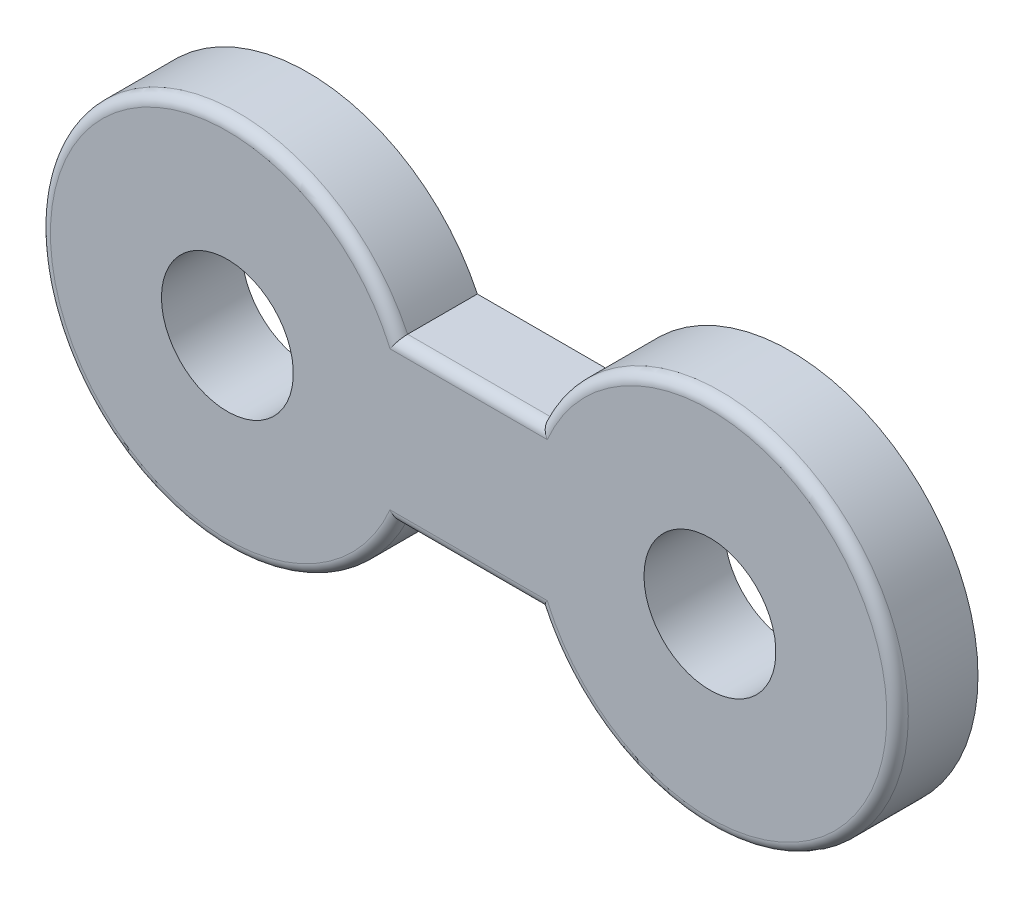
ISO-10303-21;
HEADER;
FILE_DESCRIPTION(('STEP AP214'),'2;1');
FILE_NAME('part.step','',(''),(''),'','','');
FILE_SCHEMA(('AUTOMOTIVE_DESIGN { 1 0 10303 214 1 1 1 1 }'));
ENDSEC;
DATA;
#1=APPLICATION_CONTEXT('core data for automotive mechanical design processes');
#2=APPLICATION_PROTOCOL_DEFINITION('international standard','automotive_design',2000,#1);
#3=PRODUCT_CONTEXT('',#1,'mechanical');
#4=PRODUCT('Part','Part','',(#3));
#5=PRODUCT_RELATED_PRODUCT_CATEGORY('part','',(#4));
#6=PRODUCT_DEFINITION_FORMATION('','',#4);
#7=PRODUCT_DEFINITION_CONTEXT('part definition',#1,'design');
#8=PRODUCT_DEFINITION('design','',#6,#7);
#9=PRODUCT_DEFINITION_SHAPE('','',#8);
#10=(LENGTH_UNIT() NAMED_UNIT(*) SI_UNIT(.MILLI.,.METRE.));
#11=(NAMED_UNIT(*) PLANE_ANGLE_UNIT() SI_UNIT($,.RADIAN.));
#12=(NAMED_UNIT(*) SI_UNIT($,.STERADIAN.) SOLID_ANGLE_UNIT());
#13=UNCERTAINTY_MEASURE_WITH_UNIT(LENGTH_MEASURE(1.E-05),#10,'distance_accuracy_value','');
#14=(GEOMETRIC_REPRESENTATION_CONTEXT(3) GLOBAL_UNCERTAINTY_ASSIGNED_CONTEXT((#13)) GLOBAL_UNIT_ASSIGNED_CONTEXT((#10,
#11,#12)) REPRESENTATION_CONTEXT('',''));
#15=CARTESIAN_POINT('',(0.,0.,0.));
#16=DIRECTION('',(0.,0.,1.));
#17=DIRECTION('',(1.,0.,0.));
#18=AXIS2_PLACEMENT_3D('',#15,#16,#17);
#19=CARTESIAN_POINT('',(-4.5,17.,4.50000000000001));
#20=DIRECTION('',(0.,0.,-1.));
#21=DIRECTION('',(-1.,0.,0.));
#22=AXIS2_PLACEMENT_3D('',#19,#20,#21);
#23=TOROIDAL_SURFACE('',#22,3.3,0.2);
#24=CARTESIAN_POINT('',(-4.5,17.,4.50000000000001));
#25=DIRECTION('',(0.,0.,1.));
#26=DIRECTION('',(1.,0.,0.));
#27=AXIS2_PLACEMENT_3D('',#24,#25,#26);
#28=CIRCLE('',#27,3.5);
#29=CARTESIAN_POINT('',(-1.33772233983162,15.5,4.50000000000001));
#30=VERTEX_POINT('',#29);
#31=CARTESIAN_POINT('',(-1.33772233983162,18.5,4.50000000000001));
#32=VERTEX_POINT('',#31);
#33=EDGE_CURVE('E86',#30,#32,#28,.F.);
#34=ORIENTED_EDGE('',*,*,#33,.F.);
#35=CARTESIAN_POINT('',(-1.33772233983162,15.5,4.50000000000001));
#36=CARTESIAN_POINT('',(-1.33772220757175,15.4999998468721,4.50330176187761));
#37=CARTESIAN_POINT('',(-1.33777291837924,15.5000841303596,4.50660341202501));
#38=CARTESIAN_POINT('',(-1.33797658231188,15.5004198745463,4.51321781353563));
#39=CARTESIAN_POINT('',(-1.33813023508355,15.5006724791786,4.51653048545959));
#40=CARTESIAN_POINT('',(-1.33854195200087,15.5013457340114,4.52315852111526));
#41=CARTESIAN_POINT('',(-1.33880082654772,15.5017676881902,4.52647370172627));
#42=CARTESIAN_POINT('',(-1.33942464875163,15.5027800412212,4.53309821196474));
#43=CARTESIAN_POINT('',(-1.33979050865064,15.5033718878797,4.53640723410539));
#44=CARTESIAN_POINT('',(-1.34062968918128,15.5047242368336,4.54301065481787));
#45=CARTESIAN_POINT('',(-1.3411040147462,15.5054863146849,4.54630460255742));
#46=CARTESIAN_POINT('',(-1.34216115537837,15.5071790627628,4.55286892166207));
#47=CARTESIAN_POINT('',(-1.34274505652953,15.508111418011,4.55613868303409));
#48=CARTESIAN_POINT('',(-1.34402201968995,15.5101443973097,4.56264550817497));
#49=CARTESIAN_POINT('',(-1.34471623608842,15.5112467967352,4.56588179001256));
#50=CARTESIAN_POINT('',(-1.34621412199127,15.5136192678716,4.57231239042572));
#51=CARTESIAN_POINT('',(-1.34701900016948,15.5148911856052,4.57550574559024));
#52=CARTESIAN_POINT('',(-1.348738107391,15.5176018194849,4.58184110517448));
#53=CARTESIAN_POINT('',(-1.34965358460988,15.5190424325432,4.58498195835294));
#54=CARTESIAN_POINT('',(-1.35159337750068,15.5220892992209,4.59120283025757));
#55=CARTESIAN_POINT('',(-1.35261896563308,15.5236974812081,4.59428150666241));
#56=CARTESIAN_POINT('',(-1.35477803902714,15.527078042429,4.60036847033036));
#57=CARTESIAN_POINT('',(-1.35591280564291,15.5288523627853,4.60337522383444));
#58=CARTESIAN_POINT('',(-1.3582888628728,15.5325634572829,4.60930875034911));
#59=CARTESIAN_POINT('',(-1.35953142865092,15.5345021674273,4.61223380056114));
#60=CARTESIAN_POINT('',(-1.36212121881809,15.5385400380937,4.61799430098119));
#61=CARTESIAN_POINT('',(-1.36346969681183,15.540641113438,4.62082784383983));
#62=CARTESIAN_POINT('',(-1.36626911686363,15.5450012880776,4.62639579724117));
#63=CARTESIAN_POINT('',(-1.3677212787435,15.5472622639532,4.62912812369606));
#64=CARTESIAN_POINT('',(-1.37072485813206,15.5519400088457,4.63448391531369));
#65=CARTESIAN_POINT('',(-1.3722774401438,15.554358609839,4.63710512452799));
#66=CARTESIAN_POINT('',(-1.37548019343443,15.5593472127069,4.64223000345257));
#67=CARTESIAN_POINT('',(-1.37713149212463,15.5619189613513,4.64473127011791));
#68=CARTESIAN_POINT('',(-1.3799636836472,15.5663443278572,4.64880194821307));
#69=CARTESIAN_POINT('',(-1.38112813994746,15.5681677655344,4.650415841182));
#70=CARTESIAN_POINT('',(-1.38353505090733,15.5719478883757,4.65363491905248));
#71=CARTESIAN_POINT('',(-1.38477866971816,15.5739068912145,4.65523651542219));
#72=CARTESIAN_POINT('',(-1.38734881987128,15.5779579915294,4.6584214450012));
#73=CARTESIAN_POINT('',(-1.38867662229378,15.5800521976615,4.66000106621007));
#74=CARTESIAN_POINT('',(-1.39141837445519,15.5843747357115,4.66313132268368));
#75=CARTESIAN_POINT('',(-1.39283362137859,15.5866050417641,4.66467809463673));
#76=CARTESIAN_POINT('',(-1.39575342204662,15.5912000823045,4.66773142753693));
#77=CARTESIAN_POINT('',(-1.39725929380326,15.5935666441562,4.66923397623498));
#78=CARTESIAN_POINT('',(-1.40036286710876,15.5984342753381,4.67218695666278));
#79=CARTESIAN_POINT('',(-1.40196188151274,15.6009370342354,4.67363322219243));
#80=CARTESIAN_POINT('',(-1.40525367890162,15.6060767283387,4.67646112177947));
#81=CARTESIAN_POINT('',(-1.40694774921937,15.6087152162919,4.67783843389404));
#82=CARTESIAN_POINT('',(-1.4104308858145,15.6141256374245,4.68051531540006));
#83=CARTESIAN_POINT('',(-1.41222119188957,15.6168989878647,4.681810405877));
#84=CARTESIAN_POINT('',(-1.41589723574414,15.6225779576583,4.68430917725561));
#85=CARTESIAN_POINT('',(-1.41778414408119,15.6254848585023,4.68550822254347));
#86=CARTESIAN_POINT('',(-1.42165293968033,15.6314292791007,4.68780072723309));
#87=CARTESIAN_POINT('',(-1.42363590632145,15.6344679434937,4.68888939602591));
#88=CARTESIAN_POINT('',(-1.4276953827206,15.6406737358736,4.69094652091997));
#89=CARTESIAN_POINT('',(-1.4297728586756,15.6438418697896,4.69191003473105));
#90=CARTESIAN_POINT('',(-1.43401883816596,15.6503039129464,4.69370184380489));
#91=CARTESIAN_POINT('',(-1.43618817263776,15.6535986870146,4.69452505013854));
#92=CARTESIAN_POINT('',(-1.44061417870927,15.660310761641,4.69602094124033));
#93=CARTESIAN_POINT('',(-1.44287152392904,15.6637287830751,4.69668839723264));
#94=CARTESIAN_POINT('',(-1.44746858850729,15.6706835282766,4.69785729352417));
#95=CARTESIAN_POINT('',(-1.44980880209515,15.6742208260937,4.69835337414418));
#96=CARTESIAN_POINT('',(-1.45456528775513,15.6814096777873,4.69916391389231));
#97=CARTESIAN_POINT('',(-1.45698185308983,15.6850616550805,4.69947289242563));
#98=CARTESIAN_POINT('',(-1.46188324092416,15.692474896548,4.69989376403503));
#99=CARTESIAN_POINT('',(-1.46436813314373,15.6962364328561,4.70000007116717));
#100=CARTESIAN_POINT('',(-1.46684982237938,15.7,4.70000000000001));
#101=B_SPLINE_CURVE_WITH_KNOTS('',3,(#35,#36,#37,#38,#39,#40,#41,#42,#43,#44,#45,#46,#47,#48,
#49,#50,#51,#52,#53,#54,#55,#56,#57,#58,#59,#60,#61,#62,#63,#64,#65,#66,#67,#68,#69,#70,#71,#72,
#73,#74,#75,#76,#77,#78,#79,#80,#81,#82,#83,#84,#85,#86,#87,#88,#89,#90,#91,#92,#93,#94,#95,#96,
#97,#98,#99,#100),.UNSPECIFIED.,.F.,.F.,(4,2,2,2,2,2,2,2,2,2,2,2,2,2,2,2,2,2,2,2,2,2,2,2,2,2,2,
2,2,2,2,2,4),(0.,0.00990365723768514,0.0198753170216937,0.0299252778357619,0.040063564046137,
0.0502998873991382,0.0606436130393107,0.0711037303215258,0.0816888285528028,0.0924070776744012,
0.103266213786401,0.114273529327701,0.125435867655426,0.136759621718307,0.148250736487216,
0.159914714790578,0.171756626199806,0.179852516483485,0.188308945412673,0.197127117250633,
0.206307920072989,0.215851961387085,0.225759597959243,0.236030961223869,0.246665979370979,
0.257664396995657,0.269025793027497,0.280749597528338,0.292835107843487,0.305281504507956,
0.318087867240392,0.33125319129874,0.344776404420922),.UNSPECIFIED.);
#102=CARTESIAN_POINT('',(-1.46684982237938,15.7,4.70000000000001));
#103=VERTEX_POINT('',#102);
#104=EDGE_CURVE('E80',#103,#30,#101,.F.);
#105=ORIENTED_EDGE('',*,*,#104,.F.);
#106=CARTESIAN_POINT('',(-4.5,17.,4.70000000000001));
#107=DIRECTION('',(0.,0.,-1.));
#108=DIRECTION('',(0.919136417460794,-0.393939393939395,0.));
#109=AXIS2_PLACEMENT_3D('',#106,#107,#108);
#110=CIRCLE('',#109,3.3);
#111=CARTESIAN_POINT('',(-1.46684982237938,18.3,4.70000000000001));
#112=VERTEX_POINT('',#111);
#113=EDGE_CURVE('E84',#112,#103,#110,.F.);
#114=ORIENTED_EDGE('',*,*,#113,.F.);
#115=CARTESIAN_POINT('',(-1.46684982237938,18.3,4.70000000000001));
#116=CARTESIAN_POINT('',(-1.46436863581305,18.3037628049923,4.70000007112753));
#117=CARTESIAN_POINT('',(-1.46188424296775,18.3075235769631,4.69989380706344));
#118=CARTESIAN_POINT('',(-1.45698377652355,18.3149353896502,4.69947310068824));
#119=CARTESIAN_POINT('',(-1.45456763355934,18.3185867022904,4.69916423764938));
#120=CARTESIAN_POINT('',(-1.44981191226544,18.32577432768,4.69835398771305));
#121=CARTESIAN_POINT('',(-1.44747204130778,18.3293110634258,4.69785807500138));
#122=CARTESIAN_POINT('',(-1.44287558081952,18.336264789728,4.69668955370837));
#123=CARTESIAN_POINT('',(-1.44061849791757,18.3396823537094,4.69602229867979));
#124=CARTESIAN_POINT('',(-1.43619293635336,18.3463936199928,4.69452682994969));
#125=CARTESIAN_POINT('',(-1.43402378510088,18.3496880423518,4.6937038391896));
#126=CARTESIAN_POINT('',(-1.42977809460092,18.3561494891585,4.69191246401181));
#127=CARTESIAN_POINT('',(-1.42770072556604,18.3593173774283,4.69094916298638));
#128=CARTESIAN_POINT('',(-1.42364138963345,18.3655227853518,4.68889244988382));
#129=CARTESIAN_POINT('',(-1.42165845775519,18.3685613097498,4.6878039748578));
#130=CARTESIAN_POINT('',(-1.41778966355297,18.3745055563145,4.68551182864575));
#131=CARTESIAN_POINT('',(-1.41590272308237,18.3774124217597,4.68431294312313));
#132=CARTESIAN_POINT('',(-1.41222655302539,18.3830914252715,4.68181444825032));
#133=CARTESIAN_POINT('',(-1.41043615407899,18.3858648432946,4.68051946985338));
#134=CARTESIAN_POINT('',(-1.40695277675185,18.3912755022101,4.67784275685493));
#135=CARTESIAN_POINT('',(-1.40525855968515,18.393914158652,4.67646549677984));
#136=CARTESIAN_POINT('',(-1.40196642127687,18.3990542900445,4.6736376343213));
#137=CARTESIAN_POINT('',(-1.40036721357892,18.4015573158476,4.67219134974964));
#138=CARTESIAN_POINT('',(-1.3972632141039,18.4064255786667,4.66923825435901));
#139=CARTESIAN_POINT('',(-1.39575711025822,18.4087925031543,4.66773560584557));
#140=CARTESIAN_POINT('',(-1.39283681362225,18.4133883637334,4.66468198764625));
#141=CARTESIAN_POINT('',(-1.39142130337954,18.4156191248879,4.66313502653622));
#142=CARTESIAN_POINT('',(-1.38867900188151,18.4199426660356,4.66000429907052));
#143=CARTESIAN_POINT('',(-1.38735091366871,18.422037417573,4.65842439252869));
#144=CARTESIAN_POINT('',(-1.38478017391347,18.4260896951382,4.65523879190195));
#145=CARTESIAN_POINT('',(-1.38353625132364,18.4280493271064,4.65363680655333));
#146=CARTESIAN_POINT('',(-1.38112873437936,18.431830804056,4.65041685028621));
#147=CARTESIAN_POINT('',(-1.37996397495405,18.4336549630798,4.64880246454438));
#148=CARTESIAN_POINT('',(-1.37713183737991,18.438080870374,4.64473162359764));
#149=CARTESIAN_POINT('',(-1.37548088091836,18.4406524764292,4.64223073661125));
#150=CARTESIAN_POINT('',(-1.37227871730159,18.4456408174706,4.637106599184));
#151=CARTESIAN_POINT('',(-1.37072638474333,18.4480592978844,4.63448574936676));
#152=CARTESIAN_POINT('',(-1.36772323194098,18.4527368405768,4.62913065514996));
#153=CARTESIAN_POINT('',(-1.36627124898771,18.4549977330528,4.62639866426391));
#154=CARTESIAN_POINT('',(-1.36347211641717,18.4593577728127,4.62083134866086));
#155=CARTESIAN_POINT('',(-1.36212374889171,18.4614587948089,4.61799810573735));
#156=CARTESIAN_POINT('',(-1.35953411755568,18.4654965890411,4.6122381632607));
#157=CARTESIAN_POINT('',(-1.35829160207744,18.4674352740463,4.6093133688695));
#158=CARTESIAN_POINT('',(-1.35591559079575,18.4711463449782,4.60338030382857));
#159=CARTESIAN_POINT('',(-1.35478082180476,18.47292066469,4.60037375391343));
#160=CARTESIAN_POINT('',(-1.35262169739747,18.4763012478553,4.59428714020022));
#161=CARTESIAN_POINT('',(-1.35159606263075,18.4779094500396,4.59120860822617));
#162=CARTESIAN_POINT('',(-1.34965613895859,18.4809563764816,4.58498796191093));
#163=CARTESIAN_POINT('',(-1.34874057961924,18.4823970265426,4.58184718809532));
#164=CARTESIAN_POINT('',(-1.34702127979023,18.4851077497303,4.57551191899692));
#165=CARTESIAN_POINT('',(-1.34621629316835,18.4863797170337,4.57231857330992));
#166=CARTESIAN_POINT('',(-1.34471817143129,18.488752298353,4.56588791972264));
#167=CARTESIAN_POINT('',(-1.3440238296968,18.4898547554905,4.56265157375083));
#168=CARTESIAN_POINT('',(-1.34274660653187,18.4918878568633,4.55614454540892));
#169=CARTESIAN_POINT('',(-1.342162572772,18.4928202734157,4.55287464366383));
#170=CARTESIAN_POINT('',(-1.34110516731184,18.4945131462684,4.54630996715602));
#171=CARTESIAN_POINT('',(-1.34063071158638,18.4952752843888,4.54301580127031));
#172=CARTESIAN_POINT('',(-1.33979128087249,18.4966277515178,4.53641186695666));
#173=CARTESIAN_POINT('',(-1.33942530300172,18.4972196527541,4.53310254844852));
#174=CARTESIAN_POINT('',(-1.33880126468679,18.4982321080565,4.52647736855106));
#175=CARTESIAN_POINT('',(-1.33854229403621,18.4986541064968,4.5231618139522));
#176=CARTESIAN_POINT('',(-1.33813041431719,18.4993274384529,4.51653295485847));
#177=CARTESIAN_POINT('',(-1.33797669686097,18.4995800724357,4.51321983301329));
#178=CARTESIAN_POINT('',(-1.33777294230972,18.4999158596345,4.50660445847395));
#179=CARTESIAN_POINT('',(-1.33772220754725,18.5000001532275,4.50330228498382));
#180=CARTESIAN_POINT('',(-1.33772233983162,18.5,4.50000000000001));
#181=B_SPLINE_CURVE_WITH_KNOTS('',3,(#115,#116,#117,#118,#119,#120,#121,#122,#123,#124,#125,
#126,#127,#128,#129,#130,#131,#132,#133,#134,#135,#136,#137,#138,#139,#140,#141,#142,#143,#144,
#145,#146,#147,#148,#149,#150,#151,#152,#153,#154,#155,#156,#157,#158,#159,#160,#161,#162,#163,
#164,#165,#166,#167,#168,#169,#170,#171,#172,#173,#174,#175,#176,#177,#178,#179,#180),
.UNSPECIFIED.,.F.,.F.,(4,2,2,2,2,2,2,2,2,2,2,2,2,2,2,2,2,2,2,2,2,2,2,2,2,2,2,2,2,2,2,2,4),(0.,
0.0135204749154845,0.0266834208548697,0.0394877670215754,0.0519325100393152,0.0640167308699094,
0.0757396111469725,0.0871004491479501,0.0980986756775224,0.108733870193665,0.119005777576375,
0.128914326022114,0.138459646649717,0.147642095532483,0.156462279035496,0.164921083549041,
0.173019710984249,0.184860195491844,0.196522924458563,0.20801297159047,0.219335843756472,
0.230497489839418,0.241504306532758,0.252363140727979,0.263081288140635,0.273666487838633,
0.28412691236807,0.294471153221531,0.304708201463173,0.314847423414265,0.324898531411568,
0.334871549776223,0.344776776268462),.UNSPECIFIED.);
#182=EDGE_CURVE('E109',#32,#112,#181,.F.);
#183=ORIENTED_EDGE('',*,*,#182,.F.);
#184=EDGE_LOOP('',(#34,#105,#114,#183));
#185=FACE_BOUND('',#184,.T.);
#186=ADVANCED_FACE('F17',(#185),#23,.T.);
#187=CARTESIAN_POINT('',(2.25,15.7,4.50000000000001));
#188=DIRECTION('',(-1.,0.,0.));
#189=DIRECTION('',(0.,-1.,0.));
#190=AXIS2_PLACEMENT_3D('',#187,#188,#189);
#191=CYLINDRICAL_SURFACE('',#190,0.2);
#192=DIRECTION('',(1.,0.,0.));
#193=VECTOR('',#192,1.);
#194=CARTESIAN_POINT('',(4.5,15.5,4.50000000000001));
#195=LINE('',#194,#193);
#196=CARTESIAN_POINT('',(1.33772233983162,15.5,4.50000000000001));
#197=VERTEX_POINT('',#196);
#198=EDGE_CURVE('E119',#197,#30,#195,.F.);
#199=ORIENTED_EDGE('',*,*,#198,.F.);
#200=CARTESIAN_POINT('',(1.46684982237938,15.7,4.70000000000001));
#201=CARTESIAN_POINT('',(1.4643686358136,15.6962371950086,4.70000007112753));
#202=CARTESIAN_POINT('',(1.46188424296885,15.6924764230386,4.69989380706349));
#203=CARTESIAN_POINT('',(1.45698377652566,15.685064610353,4.69947310068847));
#204=CARTESIAN_POINT('',(1.45456763356191,15.6814132977135,4.69916423764974));
#205=CARTESIAN_POINT('',(1.44981191226884,15.6742256723253,4.69835398771372));
#206=CARTESIAN_POINT('',(1.44747204131156,15.6706889365801,4.69785807500223));
#207=CARTESIAN_POINT('',(1.44287558082396,15.663735210279,4.69668955370964));
#208=CARTESIAN_POINT('',(1.44061849792229,15.6603176462981,4.69602229868128));
#209=CARTESIAN_POINT('',(1.43619293635858,15.6536063800156,4.69452682995164));
#210=CARTESIAN_POINT('',(1.43402378510629,15.650311957657,4.69370383919179));
#211=CARTESIAN_POINT('',(1.42977809460665,15.643850510851,4.69191246401447));
#212=CARTESIAN_POINT('',(1.42770072557189,15.6406826225814,4.69094916298928));
#213=CARTESIAN_POINT('',(1.42364138963945,15.6344772146584,4.68889244988716));
#214=CARTESIAN_POINT('',(1.42165845776123,15.6314386902605,4.68780397486136));
#215=CARTESIAN_POINT('',(1.41778966355901,15.625494443696,4.6855118286497));
#216=CARTESIAN_POINT('',(1.41590272308837,15.6225875782508,4.68431294312726));
#217=CARTESIAN_POINT('',(1.41222655303126,15.616908574739,4.68181444825474));
#218=CARTESIAN_POINT('',(1.41043615408475,15.6141351567158,4.68051946985793));
#219=CARTESIAN_POINT('',(1.40695277675735,15.6087244978,4.67784275685967));
#220=CARTESIAN_POINT('',(1.40525855969049,15.606085841358,4.67646549678463));
#221=CARTESIAN_POINT('',(1.40196642128183,15.600945709965,4.67363763432613));
#222=CARTESIAN_POINT('',(1.40036721358367,15.5984426841616,4.67219134975445));
#223=CARTESIAN_POINT('',(1.39726321410819,15.5935744213418,4.6692382543637));
#224=CARTESIAN_POINT('',(1.39575711026226,15.5912074968538,4.66773560585015));
#225=CARTESIAN_POINT('',(1.39283681362574,15.5866116362738,4.66468198765051));
#226=CARTESIAN_POINT('',(1.39142130338275,15.5843808751188,4.66313502654028));
#227=CARTESIAN_POINT('',(1.38867900188412,15.58005733397,4.66000429907406));
#228=CARTESIAN_POINT('',(1.387350913671,15.5779625824321,4.65842439253191));
#229=CARTESIAN_POINT('',(1.38478017391511,15.5739103048655,4.65523879190445));
#230=CARTESIAN_POINT('',(1.38353625132495,15.5719506728966,4.65363680655539));
#231=CARTESIAN_POINT('',(1.38112873438001,15.5681691959456,4.65041685028732));
#232=CARTESIAN_POINT('',(1.37996397495437,15.5663450369209,4.64880246454495));
#233=CARTESIAN_POINT('',(1.37713183738029,15.5619191296261,4.64473162359803));
#234=CARTESIAN_POINT('',(1.37548088091912,15.5593475235711,4.64223073661206));
#235=CARTESIAN_POINT('',(1.37227871730299,15.55435918253,4.63710659918562));
#236=CARTESIAN_POINT('',(1.37072638474501,15.5519407021163,4.63448574936878));
#237=CARTESIAN_POINT('',(1.36772323194313,15.5472631594242,4.62913065515274));
#238=CARTESIAN_POINT('',(1.36627124899005,15.5450022669483,4.62639866426706));
#239=CARTESIAN_POINT('',(1.36347211641983,15.5406422271885,4.62083134866471));
#240=CARTESIAN_POINT('',(1.36212374889449,15.5385412051923,4.61799810574153));
#241=CARTESIAN_POINT('',(1.35953411755864,15.5345034109603,4.61223816326549));
#242=CARTESIAN_POINT('',(1.35829160208045,15.5325647259551,4.60931336887457));
#243=CARTESIAN_POINT('',(1.35591559079881,15.5288536550232,4.60338030383415));
#244=CARTESIAN_POINT('',(1.35478082180782,15.5270793353114,4.60037375391924));
#245=CARTESIAN_POINT('',(1.35262169740047,15.5236987521461,4.59428714020642));
#246=CARTESIAN_POINT('',(1.3515960626337,15.5220905499618,4.59120860823252));
#247=CARTESIAN_POINT('',(1.3496561389614,15.5190436235197,4.58498796191753));
#248=CARTESIAN_POINT('',(1.34874057962196,15.5176029734586,4.58184718810201));
#249=CARTESIAN_POINT('',(1.34702127979274,15.5148922502708,4.5755119190037));
#250=CARTESIAN_POINT('',(1.34621629317074,15.5136202829675,4.57231857331671));
#251=CARTESIAN_POINT('',(1.34471817143341,15.511247701648,4.56588791972938));
#252=CARTESIAN_POINT('',(1.34402382969879,15.5101452445104,4.5626515737575));
#253=CARTESIAN_POINT('',(1.34274660653358,15.5081121431375,4.55614454541536));
#254=CARTESIAN_POINT('',(1.34216257277355,15.5071797265851,4.55287464367012));
#255=CARTESIAN_POINT('',(1.34110516731311,15.5054868537322,4.54630996716191));
#256=CARTESIAN_POINT('',(1.3406307115875,15.5047247156117,4.54301580127597));
#257=CARTESIAN_POINT('',(1.33979128087334,15.5033722484826,4.53641186696175));
#258=CARTESIAN_POINT('',(1.33942530300244,15.5027803472462,4.53310254845329));
#259=CARTESIAN_POINT('',(1.33880126468728,15.5017678919437,4.52647736855509));
#260=CARTESIAN_POINT('',(1.33854229403659,15.5013458935033,4.52316181395582));
#261=CARTESIAN_POINT('',(1.33813041431739,15.5006725615472,4.51653295486119));
#262=CARTESIAN_POINT('',(1.33797669686109,15.5004199275644,4.51321983301551));
#263=CARTESIAN_POINT('',(1.33777294230974,15.5000841403655,4.5066044584751));
#264=CARTESIAN_POINT('',(1.33772220754725,15.4999998467725,4.5033022849844));
#265=CARTESIAN_POINT('',(1.33772233983162,15.5,4.50000000000001));
#266=B_SPLINE_CURVE_WITH_KNOTS('',3,(#200,#201,#202,#203,#204,#205,#206,#207,#208,#209,#210,
#211,#212,#213,#214,#215,#216,#217,#218,#219,#220,#221,#222,#223,#224,#225,#226,#227,#228,#229,
#230,#231,#232,#233,#234,#235,#236,#237,#238,#239,#240,#241,#242,#243,#244,#245,#246,#247,#248,
#249,#250,#251,#252,#253,#254,#255,#256,#257,#258,#259,#260,#261,#262,#263,#264,#265),
.UNSPECIFIED.,.F.,.F.,(4,2,2,2,2,2,2,2,2,2,2,2,2,2,2,2,2,2,2,2,2,2,2,2,2,2,2,2,2,2,2,2,4),(0.,
0.0135204749124867,0.026683420849267,0.0394877670137593,0.0519325100296896,0.0640167308588709,
0.0757396111349196,0.087100449135289,0.0980986756646493,0.108733870180986,0.119005777564294,
0.128914326011029,0.138459646640036,0.147642095524606,0.156462279029821,0.164921083545971,
0.173019710984179,0.184860195490204,0.196522924455548,0.208012971586283,0.219335843751317,
0.230497489833499,0.241504306526293,0.252363140721182,0.263081288133724,0.273666487831834,
0.284126912361609,0.294471153215637,0.304708201458075,0.314847423410195,0.324898531408759,
0.334871549774908,0.344776776268871),.UNSPECIFIED.);
#267=CARTESIAN_POINT('',(1.46684982237938,15.7,4.70000000000001));
#268=VERTEX_POINT('',#267);
#269=EDGE_CURVE('E93',#268,#197,#266,.T.);
#270=ORIENTED_EDGE('',*,*,#269,.F.);
#271=DIRECTION('',(1.,0.,0.));
#272=VECTOR('',#271,1.);
#273=CARTESIAN_POINT('',(0.,15.7,4.70000000000001));
#274=LINE('',#273,#272);
#275=EDGE_CURVE('E100',#103,#268,#274,.T.);
#276=ORIENTED_EDGE('',*,*,#275,.F.);
#277=ORIENTED_EDGE('',*,*,#104,.T.);
#278=EDGE_LOOP('',(#199,#270,#276,#277));
#279=FACE_BOUND('',#278,.T.);
#280=ADVANCED_FACE('F105',(#279),#191,.T.);
#281=CARTESIAN_POINT('',(4.5,17.,4.50000000000001));
#282=DIRECTION('',(0.,0.,-1.));
#283=DIRECTION('',(-1.,0.,0.));
#284=AXIS2_PLACEMENT_3D('',#281,#282,#283);
#285=TOROIDAL_SURFACE('',#284,3.3,0.2);
#286=CARTESIAN_POINT('',(4.5,17.,4.50000000000001));
#287=DIRECTION('',(0.,0.,1.));
#288=DIRECTION('',(1.,0.,0.));
#289=AXIS2_PLACEMENT_3D('',#286,#287,#288);
#290=CIRCLE('',#289,3.5);
#291=CARTESIAN_POINT('',(1.33772233983162,18.5,4.50000000000001));
#292=VERTEX_POINT('',#291);
#293=EDGE_CURVE('E127',#292,#197,#290,.F.);
#294=ORIENTED_EDGE('',*,*,#293,.F.);
#295=CARTESIAN_POINT('',(1.33772233983162,18.5,4.50000000000001));
#296=CARTESIAN_POINT('',(1.33772220757174,18.5000001531279,4.50330176187768));
#297=CARTESIAN_POINT('',(1.33777291837924,18.4999158696404,4.50660341202514));
#298=CARTESIAN_POINT('',(1.33797658231189,18.4995801254537,4.51321781353587));
#299=CARTESIAN_POINT('',(1.33813023508357,18.4993275208214,4.51653048545989));
#300=CARTESIAN_POINT('',(1.33854195200091,18.4986542659886,4.52315852111565));
#301=CARTESIAN_POINT('',(1.33880082654776,18.4982323118097,4.52647370172671));
#302=CARTESIAN_POINT('',(1.33942464875171,18.4972199587788,4.53309821196526));
#303=CARTESIAN_POINT('',(1.33979050865073,18.4966281121203,4.53640723410596));
#304=CARTESIAN_POINT('',(1.3406296891814,18.4952757631663,4.5430106548185));
#305=CARTESIAN_POINT('',(1.34110401474634,18.494513685315,4.54630460255807));
#306=CARTESIAN_POINT('',(1.34216115537854,18.4928209372371,4.55286892166277));
#307=CARTESIAN_POINT('',(1.34274505652972,18.4918885819889,4.5561386830348));
#308=CARTESIAN_POINT('',(1.34402201969016,18.4898556026902,4.56264550817571));
#309=CARTESIAN_POINT('',(1.34471623608865,18.4887532032647,4.56588179001331));
#310=CARTESIAN_POINT('',(1.34621412199153,18.4863807321283,4.57231239042648));
#311=CARTESIAN_POINT('',(1.34701900016975,18.4851088143947,4.57550574559099));
#312=CARTESIAN_POINT('',(1.34873810739129,18.4823981805149,4.58184110517523));
#313=CARTESIAN_POINT('',(1.34965358461018,18.4809575674567,4.58498195835368));
#314=CARTESIAN_POINT('',(1.35159337750101,18.477910700779,4.59120283025828));
#315=CARTESIAN_POINT('',(1.35261896563341,18.4763025187918,4.5942815066631));
#316=CARTESIAN_POINT('',(1.35477803902747,18.4729219575708,4.60036847033101));
#317=CARTESIAN_POINT('',(1.35591280564325,18.4711476372145,4.60337522383507));
#318=CARTESIAN_POINT('',(1.35828886287314,18.467436542717,4.60930875034969));
#319=CARTESIAN_POINT('',(1.35953142865125,18.4654978325725,4.61223380056169));
#320=CARTESIAN_POINT('',(1.3621212188184,18.4614599619061,4.61799430098168));
#321=CARTESIAN_POINT('',(1.36346969681213,18.4593588865618,4.62082784384028));
#322=CARTESIAN_POINT('',(1.3662691168639,18.4549987119223,4.62639579724154));
#323=CARTESIAN_POINT('',(1.36772127874375,18.4527377360467,4.62912812369639));
#324=CARTESIAN_POINT('',(1.37072485813225,18.4480599911542,4.63448391531394));
#325=CARTESIAN_POINT('',(1.37227744014397,18.4456413901609,4.6371051245282));
#326=CARTESIAN_POINT('',(1.37548019343453,18.440652787293,4.6422300034527));
#327=CARTESIAN_POINT('',(1.37713149212468,18.4380810386486,4.64473127011798));
#328=CARTESIAN_POINT('',(1.37996368364722,18.4336556721427,4.64880194821312));
#329=CARTESIAN_POINT('',(1.38112813994748,18.4318322344655,4.65041584118206));
#330=CARTESIAN_POINT('',(1.38353505090736,18.4280521116242,4.65363491905256));
#331=CARTESIAN_POINT('',(1.38477866971818,18.4260931087853,4.65523651542228));
#332=CARTESIAN_POINT('',(1.38734881987131,18.4220420084704,4.6584214450013));
#333=CARTESIAN_POINT('',(1.38867662229382,18.4199478023382,4.66000106621018));
#334=CARTESIAN_POINT('',(1.39141837445522,18.4156252642882,4.6631313226838));
#335=CARTESIAN_POINT('',(1.39283362137863,18.4133949582356,4.66467809463686));
#336=CARTESIAN_POINT('',(1.39575342204666,18.4087999176952,4.66773142753706));
#337=CARTESIAN_POINT('',(1.39725929380331,18.4064333558434,4.66923397623511));
#338=CARTESIAN_POINT('',(1.40036286710881,18.4015657246615,4.67218695666291));
#339=CARTESIAN_POINT('',(1.40196188151279,18.3990629657642,4.67363322219256));
#340=CARTESIAN_POINT('',(1.40525367890168,18.3939232716609,4.6764611217796));
#341=CARTESIAN_POINT('',(1.40694774921944,18.3912847837077,4.67783843389416));
#342=CARTESIAN_POINT('',(1.41043088581457,18.3858743625751,4.68051531540018));
#343=CARTESIAN_POINT('',(1.41222119188964,18.3831010121348,4.68181040587712));
#344=CARTESIAN_POINT('',(1.41589723574421,18.3774220423413,4.68430917725572));
#345=CARTESIAN_POINT('',(1.41778414408126,18.3745151414973,4.68550822254357));
#346=CARTESIAN_POINT('',(1.4216529396804,18.3685707208989,4.68780072723318));
#347=CARTESIAN_POINT('',(1.42363590632153,18.3655320565059,4.688889396026));
#348=CARTESIAN_POINT('',(1.42769538272068,18.359326264126,4.69094652092004));
#349=CARTESIAN_POINT('',(1.42977285867567,18.35615813021,4.69191003473112));
#350=CARTESIAN_POINT('',(1.43401883816603,18.3496960870532,4.69370184380494));
#351=CARTESIAN_POINT('',(1.43618817263782,18.3464013129851,4.69452505013859));
#352=CARTESIAN_POINT('',(1.44061417870933,18.3396892383587,4.69602094124037));
#353=CARTESIAN_POINT('',(1.44287152392909,18.3362712169246,4.69668839723268));
#354=CARTESIAN_POINT('',(1.44746858850734,18.3293164717232,4.69785729352419));
#355=CARTESIAN_POINT('',(1.44980880209519,18.3257791739061,4.6983533741442));
#356=CARTESIAN_POINT('',(1.45456528775515,18.3185903222125,4.69916391389231));
#357=CARTESIAN_POINT('',(1.45698185308985,18.3149383449194,4.69947289242564));
#358=CARTESIAN_POINT('',(1.46188324092417,18.307525103452,4.69989376403503));
#359=CARTESIAN_POINT('',(1.46436813314373,18.3037635671439,4.70000007116717));
#360=CARTESIAN_POINT('',(1.46684982237937,18.3,4.70000000000001));
#361=B_SPLINE_CURVE_WITH_KNOTS('',3,(#295,#296,#297,#298,#299,#300,#301,#302,#303,#304,#305,
#306,#307,#308,#309,#310,#311,#312,#313,#314,#315,#316,#317,#318,#319,#320,#321,#322,#323,#324,
#325,#326,#327,#328,#329,#330,#331,#332,#333,#334,#335,#336,#337,#338,#339,#340,#341,#342,#343,
#344,#345,#346,#347,#348,#349,#350,#351,#352,#353,#354,#355,#356,#357,#358,#359,#360),
.UNSPECIFIED.,.F.,.F.,(4,2,2,2,2,2,2,2,2,2,2,2,2,2,2,2,2,2,2,2,2,2,2,2,2,2,2,2,2,2,2,2,4),(0.,
0.00990365723787526,0.0198753170220471,0.0299252778362553,0.0400635640467453,0.0502998873998355,
0.0606436130400721,0.0711037303223283,0.0816888285536196,0.0924070776752091,0.103266213787177,
0.114273529328423,0.125435867656069,0.136759621718848,0.148250736487636,0.159914714790855,
0.171756626199916,0.179852516483683,0.188308945412949,0.197127117250971,0.206307920073382,
0.215851961387516,0.225759597959703,0.236030961224345,0.246665979371456,0.257664396996123,
0.269025793027939,0.280749597528748,0.292835107843846,0.305281504508252,0.318087867240617,
0.331253191298876,0.344776404420962),.UNSPECIFIED.);
#362=CARTESIAN_POINT('',(1.46684982237937,18.3,4.70000000000001));
#363=VERTEX_POINT('',#362);
#364=EDGE_CURVE('E57',#363,#292,#361,.F.);
#365=ORIENTED_EDGE('',*,*,#364,.F.);
#366=CARTESIAN_POINT('',(4.5,17.,4.70000000000001));
#367=DIRECTION('',(0.,0.,-1.));
#368=DIRECTION('',(-0.919136417460794,0.393939393939393,0.));
#369=AXIS2_PLACEMENT_3D('',#366,#367,#368);
#370=CIRCLE('',#369,3.3);
#371=EDGE_CURVE('E108',#268,#363,#370,.F.);
#372=ORIENTED_EDGE('',*,*,#371,.F.);
#373=ORIENTED_EDGE('',*,*,#269,.T.);
#374=EDGE_LOOP('',(#294,#365,#372,#373));
#375=FACE_BOUND('',#374,.T.);
#376=ADVANCED_FACE('F148',(#375),#285,.T.);
#377=CARTESIAN_POINT('',(-2.25,18.3,4.50000000000001));
#378=DIRECTION('',(1.,0.,0.));
#379=DIRECTION('',(0.,1.,0.));
#380=AXIS2_PLACEMENT_3D('',#377,#378,#379);
#381=CYLINDRICAL_SURFACE('',#380,0.2);
#382=DIRECTION('',(1.,0.,0.));
#383=VECTOR('',#382,1.);
#384=CARTESIAN_POINT('',(-4.5,18.5,4.50000000000001));
#385=LINE('',#384,#383);
#386=EDGE_CURVE('E122',#32,#292,#385,.T.);
#387=ORIENTED_EDGE('',*,*,#386,.F.);
#388=ORIENTED_EDGE('',*,*,#182,.T.);
#389=DIRECTION('',(1.,0.,0.));
#390=VECTOR('',#389,1.);
#391=CARTESIAN_POINT('',(0.,18.3,4.70000000000001));
#392=LINE('',#391,#390);
#393=EDGE_CURVE('E102',#363,#112,#392,.F.);
#394=ORIENTED_EDGE('',*,*,#393,.F.);
#395=ORIENTED_EDGE('',*,*,#364,.T.);
#396=EDGE_LOOP('',(#387,#388,#394,#395));
#397=FACE_BOUND('',#396,.T.);
#398=ADVANCED_FACE('F138',(#397),#381,.T.);
#399=CARTESIAN_POINT('',(0.,17.,4.70000000000001));
#400=DIRECTION('',(0.,0.,1.));
#401=DIRECTION('',(1.,0.,0.));
#402=AXIS2_PLACEMENT_3D('',#399,#400,#401);
#403=PLANE('',#402);
#404=CARTESIAN_POINT('',(4.5,17.,4.70000000000002));
#405=DIRECTION('',(0.,0.,-1.));
#406=DIRECTION('',(-1.,0.,0.));
#407=AXIS2_PLACEMENT_3D('',#404,#405,#406);
#408=CIRCLE('',#407,1.2295);
#409=CARTESIAN_POINT('',(3.2705,17.,4.70000000000002));
#410=VERTEX_POINT('',#409);
#411=EDGE_CURVE('E21',#410,#410,#408,.T.);
#412=ORIENTED_EDGE('',*,*,#411,.T.);
#413=EDGE_LOOP('',(#412));
#414=FACE_BOUND('',#413,.T.);
#415=CARTESIAN_POINT('',(-4.5,17.,4.70000000000002));
#416=DIRECTION('',(0.,0.,-1.));
#417=DIRECTION('',(-1.,0.,0.));
#418=AXIS2_PLACEMENT_3D('',#415,#416,#417);
#419=CIRCLE('',#418,1.2295);
#420=CARTESIAN_POINT('',(-5.7295,17.,4.70000000000002));
#421=VERTEX_POINT('',#420);
#422=EDGE_CURVE('E224',#421,#421,#419,.T.);
#423=ORIENTED_EDGE('',*,*,#422,.T.);
#424=EDGE_LOOP('',(#423));
#425=FACE_BOUND('',#424,.T.);
#426=ORIENTED_EDGE('',*,*,#393,.T.);
#427=ORIENTED_EDGE('',*,*,#113,.T.);
#428=ORIENTED_EDGE('',*,*,#275,.T.);
#429=ORIENTED_EDGE('',*,*,#371,.T.);
#430=EDGE_LOOP('',(#426,#427,#428,#429));
#431=FACE_BOUND('',#430,.T.);
#432=ADVANCED_FACE('F99',(#414,#425,#431),#403,.T.);
#433=CARTESIAN_POINT('',(-4.5,17.,3.95000000000001));
#434=DIRECTION('',(0.,0.,1.));
#435=DIRECTION('',(1.,0.,0.));
#436=AXIS2_PLACEMENT_3D('',#433,#434,#435);
#437=CYLINDRICAL_SURFACE('',#436,3.5);
#438=CARTESIAN_POINT('',(-4.5,17.,3.20000000000001));
#439=DIRECTION('',(0.,0.,1.));
#440=DIRECTION('',(1.,0.,0.));
#441=AXIS2_PLACEMENT_3D('',#438,#439,#440);
#442=CIRCLE('',#441,3.5);
#443=CARTESIAN_POINT('',(-1.33772233983162,18.5,3.20000000000001));
#444=VERTEX_POINT('',#443);
#445=CARTESIAN_POINT('',(-1.33772233983162,15.5,3.20000000000001));
#446=VERTEX_POINT('',#445);
#447=EDGE_CURVE('E47',#444,#446,#442,.T.);
#448=ORIENTED_EDGE('',*,*,#447,.T.);
#449=DIRECTION('',(0.,0.,-1.));
#450=VECTOR('',#449,1.);
#451=CARTESIAN_POINT('',(-1.33772233983162,15.5,3.95000000000001));
#452=LINE('',#451,#450);
#453=EDGE_CURVE('E130',#30,#446,#452,.T.);
#454=ORIENTED_EDGE('',*,*,#453,.F.);
#455=ORIENTED_EDGE('',*,*,#33,.T.);
#456=DIRECTION('',(0.,0.,1.));
#457=VECTOR('',#456,1.);
#458=CARTESIAN_POINT('',(-1.33772233983162,18.5,3.95000000000001));
#459=LINE('',#458,#457);
#460=EDGE_CURVE('E218',#444,#32,#459,.T.);
#461=ORIENTED_EDGE('',*,*,#460,.F.);
#462=EDGE_LOOP('',(#448,#454,#455,#461));
#463=FACE_BOUND('',#462,.T.);
#464=ADVANCED_FACE('F285',(#463),#437,.T.);
#465=CARTESIAN_POINT('',(4.5,15.5,3.95000000000001));
#466=DIRECTION('',(0.,-1.,0.));
#467=DIRECTION('',(0.,0.,-1.));
#468=AXIS2_PLACEMENT_3D('',#465,#466,#467);
#469=PLANE('',#468);
#470=DIRECTION('',(1.,0.,0.));
#471=VECTOR('',#470,1.);
#472=CARTESIAN_POINT('',(0.,15.5,3.20000000000001));
#473=LINE('',#472,#471);
#474=CARTESIAN_POINT('',(1.33772233983162,15.5,3.20000000000001));
#475=VERTEX_POINT('',#474);
#476=EDGE_CURVE('E262',#446,#475,#473,.T.);
#477=ORIENTED_EDGE('',*,*,#476,.T.);
#478=DIRECTION('',(0.,0.,1.));
#479=VECTOR('',#478,1.);
#480=CARTESIAN_POINT('',(1.33772233983162,15.5,3.95000000000001));
#481=LINE('',#480,#479);
#482=EDGE_CURVE('E124',#197,#475,#481,.F.);
#483=ORIENTED_EDGE('',*,*,#482,.F.);
#484=ORIENTED_EDGE('',*,*,#198,.T.);
#485=ORIENTED_EDGE('',*,*,#453,.T.);
#486=EDGE_LOOP('',(#477,#483,#484,#485));
#487=FACE_BOUND('',#486,.T.);
#488=ADVANCED_FACE('F282',(#487),#469,.T.);
#489=CARTESIAN_POINT('',(4.5,17.,3.95000000000001));
#490=DIRECTION('',(0.,0.,1.));
#491=DIRECTION('',(1.,0.,0.));
#492=AXIS2_PLACEMENT_3D('',#489,#490,#491);
#493=CYLINDRICAL_SURFACE('',#492,3.5);
#494=CARTESIAN_POINT('',(4.5,17.,3.20000000000001));
#495=DIRECTION('',(0.,0.,1.));
#496=DIRECTION('',(1.,0.,0.));
#497=AXIS2_PLACEMENT_3D('',#494,#495,#496);
#498=CIRCLE('',#497,3.5);
#499=CARTESIAN_POINT('',(1.33772233983162,18.5,3.20000000000001));
#500=VERTEX_POINT('',#499);
#501=EDGE_CURVE('E259',#475,#500,#498,.T.);
#502=ORIENTED_EDGE('',*,*,#501,.T.);
#503=DIRECTION('',(0.,0.,1.));
#504=VECTOR('',#503,1.);
#505=CARTESIAN_POINT('',(1.33772233983162,18.5,3.95000000000001));
#506=LINE('',#505,#504);
#507=EDGE_CURVE('E36',#292,#500,#506,.F.);
#508=ORIENTED_EDGE('',*,*,#507,.F.);
#509=ORIENTED_EDGE('',*,*,#293,.T.);
#510=ORIENTED_EDGE('',*,*,#482,.T.);
#511=EDGE_LOOP('',(#502,#508,#509,#510));
#512=FACE_BOUND('',#511,.T.);
#513=ADVANCED_FACE('F292',(#512),#493,.T.);
#514=CARTESIAN_POINT('',(-4.5,18.5,3.95000000000001));
#515=DIRECTION('',(0.,1.,0.));
#516=DIRECTION('',(0.,0.,1.));
#517=AXIS2_PLACEMENT_3D('',#514,#515,#516);
#518=PLANE('',#517);
#519=DIRECTION('',(1.,0.,0.));
#520=VECTOR('',#519,1.);
#521=CARTESIAN_POINT('',(0.,18.5,3.20000000000001));
#522=LINE('',#521,#520);
#523=EDGE_CURVE('E220',#500,#444,#522,.F.);
#524=ORIENTED_EDGE('',*,*,#523,.T.);
#525=ORIENTED_EDGE('',*,*,#460,.T.);
#526=ORIENTED_EDGE('',*,*,#386,.T.);
#527=ORIENTED_EDGE('',*,*,#507,.T.);
#528=EDGE_LOOP('',(#524,#525,#526,#527));
#529=FACE_BOUND('',#528,.T.);
#530=ADVANCED_FACE('F219',(#529),#518,.T.);
#531=CARTESIAN_POINT('',(4.5,17.,4.70000000000001));
#532=DIRECTION('',(0.,0.,-1.));
#533=DIRECTION('',(-1.,0.,0.));
#534=AXIS2_PLACEMENT_3D('',#531,#532,#533);
#535=CYLINDRICAL_SURFACE('',#534,1.2295);
#536=ORIENTED_EDGE('',*,*,#411,.F.);
#537=EDGE_LOOP('',(#536));
#538=FACE_BOUND('',#537,.T.);
#539=CARTESIAN_POINT('',(4.49999999999999,17.,3.20000000000001));
#540=DIRECTION('',(0.,0.,-1.));
#541=DIRECTION('',(-1.,0.,0.));
#542=AXIS2_PLACEMENT_3D('',#539,#540,#541);
#543=CIRCLE('',#542,1.2295);
#544=CARTESIAN_POINT('',(3.27049999999999,17.,3.20000000000001));
#545=VERTEX_POINT('',#544);
#546=EDGE_CURVE('E27',#545,#545,#543,.T.);
#547=ORIENTED_EDGE('',*,*,#546,.T.);
#548=EDGE_LOOP('',(#547));
#549=FACE_BOUND('',#548,.T.);
#550=ADVANCED_FACE('F270',(#538,#549),#535,.F.);
#551=CARTESIAN_POINT('',(-4.5,17.,4.70000000000001));
#552=DIRECTION('',(0.,0.,-1.));
#553=DIRECTION('',(-1.,0.,0.));
#554=AXIS2_PLACEMENT_3D('',#551,#552,#553);
#555=CYLINDRICAL_SURFACE('',#554,1.2295);
#556=ORIENTED_EDGE('',*,*,#422,.F.);
#557=EDGE_LOOP('',(#556));
#558=FACE_BOUND('',#557,.T.);
#559=CARTESIAN_POINT('',(-4.5,17.,3.20000000000001));
#560=DIRECTION('',(0.,0.,-1.));
#561=DIRECTION('',(-1.,0.,0.));
#562=AXIS2_PLACEMENT_3D('',#559,#560,#561);
#563=CIRCLE('',#562,1.2295);
#564=CARTESIAN_POINT('',(-5.7295,17.,3.20000000000001));
#565=VERTEX_POINT('',#564);
#566=EDGE_CURVE('E11',#565,#565,#563,.T.);
#567=ORIENTED_EDGE('',*,*,#566,.T.);
#568=EDGE_LOOP('',(#567));
#569=FACE_BOUND('',#568,.T.);
#570=ADVANCED_FACE('F19',(#558,#569),#555,.F.);
#571=CARTESIAN_POINT('',(0.,17.,3.20000000000001));
#572=DIRECTION('',(0.,0.,1.));
#573=DIRECTION('',(1.,0.,0.));
#574=AXIS2_PLACEMENT_3D('',#571,#572,#573);
#575=PLANE('',#574);
#576=ORIENTED_EDGE('',*,*,#566,.F.);
#577=EDGE_LOOP('',(#576));
#578=FACE_BOUND('',#577,.T.);
#579=ORIENTED_EDGE('',*,*,#546,.F.);
#580=EDGE_LOOP('',(#579));
#581=FACE_BOUND('',#580,.T.);
#582=ORIENTED_EDGE('',*,*,#501,.F.);
#583=ORIENTED_EDGE('',*,*,#476,.F.);
#584=ORIENTED_EDGE('',*,*,#447,.F.);
#585=ORIENTED_EDGE('',*,*,#523,.F.);
#586=EDGE_LOOP('',(#582,#583,#584,#585));
#587=FACE_BOUND('',#586,.T.);
#588=ADVANCED_FACE('F269',(#578,#581,#587),#575,.F.);
#589=CLOSED_SHELL('',(#186,#280,#376,#398,#432,#464,#488,#513,#530,#550,#570,#588));
#590=MANIFOLD_SOLID_BREP('B1',#589);
#591=ADVANCED_BREP_SHAPE_REPRESENTATION('',(#18,#590),#14);
#592=SHAPE_DEFINITION_REPRESENTATION(#9,#591);
ENDSEC;
END-ISO-10303-21;
